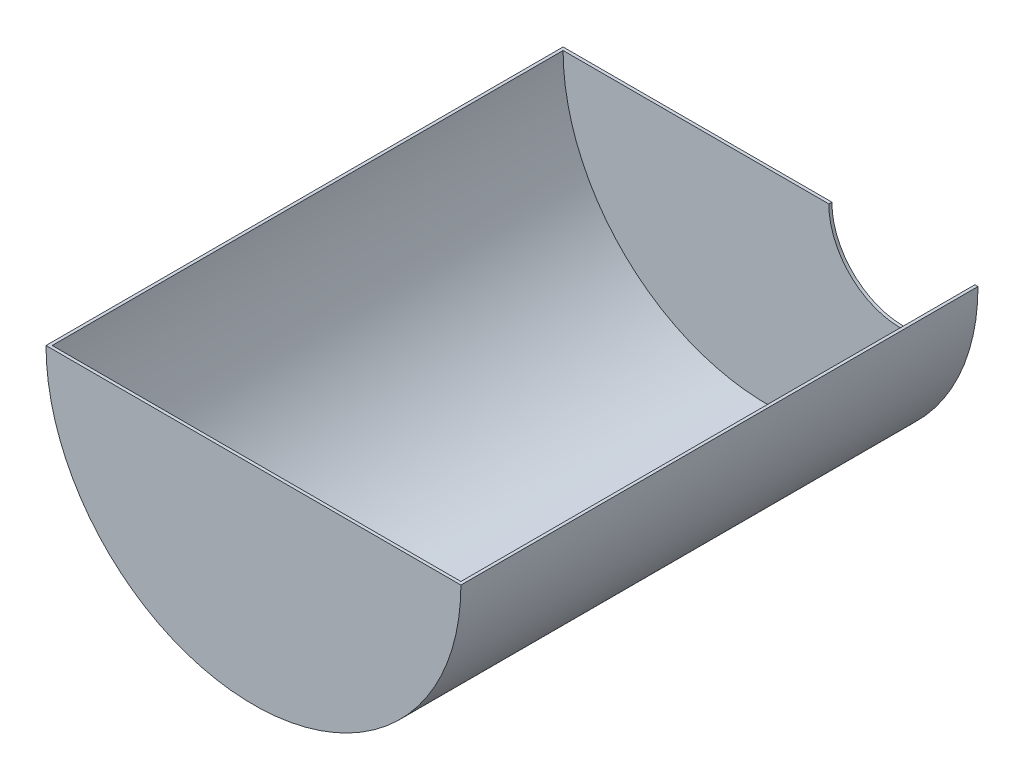
ISO-10303-21;
HEADER;
FILE_DESCRIPTION(('STEP AP214'),'2;1');
FILE_NAME('part.step','',(''),(''),'','','');
FILE_SCHEMA(('AUTOMOTIVE_DESIGN { 1 0 10303 214 1 1 1 1 }'));
ENDSEC;
DATA;
#1=APPLICATION_CONTEXT('core data for automotive mechanical design processes');
#2=APPLICATION_PROTOCOL_DEFINITION('international standard','automotive_design',2000,#1);
#3=PRODUCT_CONTEXT('',#1,'mechanical');
#4=PRODUCT('Part','Part','',(#3));
#5=PRODUCT_RELATED_PRODUCT_CATEGORY('part','',(#4));
#6=PRODUCT_DEFINITION_FORMATION('','',#4);
#7=PRODUCT_DEFINITION_CONTEXT('part definition',#1,'design');
#8=PRODUCT_DEFINITION('design','',#6,#7);
#9=PRODUCT_DEFINITION_SHAPE('','',#8);
#10=(LENGTH_UNIT() NAMED_UNIT(*) SI_UNIT(.MILLI.,.METRE.));
#11=(NAMED_UNIT(*) PLANE_ANGLE_UNIT() SI_UNIT($,.RADIAN.));
#12=(NAMED_UNIT(*) SI_UNIT($,.STERADIAN.) SOLID_ANGLE_UNIT());
#13=UNCERTAINTY_MEASURE_WITH_UNIT(LENGTH_MEASURE(1.E-05),#10,'distance_accuracy_value','');
#14=(GEOMETRIC_REPRESENTATION_CONTEXT(3) GLOBAL_UNCERTAINTY_ASSIGNED_CONTEXT((#13)) GLOBAL_UNIT_ASSIGNED_CONTEXT((#10,
#11,#12)) REPRESENTATION_CONTEXT('',''));
#15=CARTESIAN_POINT('',(0.,0.,0.));
#16=DIRECTION('',(0.,0.,1.));
#17=DIRECTION('',(1.,0.,0.));
#18=AXIS2_PLACEMENT_3D('',#15,#16,#17);
#19=CARTESIAN_POINT('',(-200.,-1.39659253553725E-12,500.));
#20=DIRECTION('',(0.,-1.,0.));
#21=DIRECTION('',(1.,0.,0.));
#22=AXIS2_PLACEMENT_3D('',#19,#20,#21);
#23=PLANE('',#22);
#24=DIRECTION('',(-1.,0.,0.));
#25=VECTOR('',#24,1.);
#26=CARTESIAN_POINT('',(-200.,-1.39659253553725E-12,0.));
#27=LINE('',#26,#25);
#28=CARTESIAN_POINT('',(60.,-4.88807387438039E-13,0.));
#29=VERTEX_POINT('',#28);
#30=CARTESIAN_POINT('',(-200.,-1.39659253553725E-12,0.));
#31=VERTEX_POINT('',#30);
#32=EDGE_CURVE('E107',#29,#31,#27,.T.);
#33=ORIENTED_EDGE('',*,*,#32,.F.);
#34=DIRECTION('',(0.,0.,-1.));
#35=VECTOR('',#34,1.);
#36=CARTESIAN_POINT('',(60.,0.,7.));
#37=LINE('',#36,#35);
#38=CARTESIAN_POINT('',(60.,0.,-3.));
#39=VERTEX_POINT('',#38);
#40=EDGE_CURVE('E58',#29,#39,#37,.T.);
#41=ORIENTED_EDGE('',*,*,#40,.T.);
#42=DIRECTION('',(-1.,0.,0.));
#43=VECTOR('',#42,1.);
#44=CARTESIAN_POINT('',(-200.,-1.39659253553725E-12,-3.));
#45=LINE('',#44,#43);
#46=CARTESIAN_POINT('',(-203.,-1.40706697955378E-12,-3.));
#47=VERTEX_POINT('',#46);
#48=EDGE_CURVE('E104',#39,#47,#45,.T.);
#49=ORIENTED_EDGE('',*,*,#48,.T.);
#50=DIRECTION('',(0.,0.,-1.));
#51=VECTOR('',#50,1.);
#52=CARTESIAN_POINT('',(-203.,-1.40706697955378E-12,503.));
#53=LINE('',#52,#51);
#54=CARTESIAN_POINT('',(-203.,-1.40706697955378E-12,503.));
#55=VERTEX_POINT('',#54);
#56=EDGE_CURVE('E124',#55,#47,#53,.T.);
#57=ORIENTED_EDGE('',*,*,#56,.F.);
#58=DIRECTION('',(-1.,0.,0.));
#59=VECTOR('',#58,1.);
#60=CARTESIAN_POINT('',(-200.,-1.39659253553725E-12,503.));
#61=LINE('',#60,#59);
#62=CARTESIAN_POINT('',(203.,0.,503.));
#63=VERTEX_POINT('',#62);
#64=EDGE_CURVE('E126',#63,#55,#61,.T.);
#65=ORIENTED_EDGE('',*,*,#64,.F.);
#66=DIRECTION('',(0.,0.,-1.));
#67=VECTOR('',#66,1.);
#68=CARTESIAN_POINT('',(203.,0.,503.));
#69=LINE('',#68,#67);
#70=CARTESIAN_POINT('',(203.,0.,-3.));
#71=VERTEX_POINT('',#70);
#72=EDGE_CURVE('E52',#63,#71,#69,.T.);
#73=ORIENTED_EDGE('',*,*,#72,.T.);
#74=CARTESIAN_POINT('',(200.,0.,-3.));
#75=VERTEX_POINT('',#74);
#76=EDGE_CURVE('E114',#71,#75,#45,.T.);
#77=ORIENTED_EDGE('',*,*,#76,.T.);
#78=DIRECTION('',(0.,0.,-1.));
#79=VECTOR('',#78,1.);
#80=CARTESIAN_POINT('',(200.,0.,7.));
#81=LINE('',#80,#79);
#82=CARTESIAN_POINT('',(200.,0.,0.));
#83=VERTEX_POINT('',#82);
#84=EDGE_CURVE('E95',#83,#75,#81,.T.);
#85=ORIENTED_EDGE('',*,*,#84,.F.);
#86=DIRECTION('',(0.,0.,-1.));
#87=VECTOR('',#86,1.);
#88=CARTESIAN_POINT('',(200.,0.,500.));
#89=LINE('',#88,#87);
#90=CARTESIAN_POINT('',(200.,0.,500.));
#91=VERTEX_POINT('',#90);
#92=EDGE_CURVE('E119',#91,#83,#89,.T.);
#93=ORIENTED_EDGE('',*,*,#92,.F.);
#94=DIRECTION('',(-1.,0.,0.));
#95=VECTOR('',#94,1.);
#96=CARTESIAN_POINT('',(-200.,-1.39659253553725E-12,500.));
#97=LINE('',#96,#95);
#98=CARTESIAN_POINT('',(-200.,-1.39659253553725E-12,500.));
#99=VERTEX_POINT('',#98);
#100=EDGE_CURVE('E139',#91,#99,#97,.T.);
#101=ORIENTED_EDGE('',*,*,#100,.T.);
#102=DIRECTION('',(0.,0.,-1.));
#103=VECTOR('',#102,1.);
#104=CARTESIAN_POINT('',(-200.,-1.39659253553725E-12,500.));
#105=LINE('',#104,#103);
#106=EDGE_CURVE('E136',#99,#31,#105,.T.);
#107=ORIENTED_EDGE('',*,*,#106,.T.);
#108=EDGE_LOOP('',(#33,#41,#49,#57,#65,#73,#77,#85,#93,#101,#107));
#109=FACE_BOUND('',#108,.T.);
#110=ADVANCED_FACE('F43',(#109),#23,.F.);
#111=CARTESIAN_POINT('',(0.,0.,500.));
#112=DIRECTION('',(0.,0.,-1.));
#113=DIRECTION('',(-1.,0.,0.));
#114=AXIS2_PLACEMENT_3D('',#111,#112,#113);
#115=CYLINDRICAL_SURFACE('',#114,203.);
#116=CARTESIAN_POINT('',(0.,0.,-3.));
#117=DIRECTION('',(0.,0.,1.));
#118=DIRECTION('',(1.,0.,0.));
#119=AXIS2_PLACEMENT_3D('',#116,#117,#118);
#120=CIRCLE('',#119,203.);
#121=EDGE_CURVE('E112',#47,#71,#120,.T.);
#122=ORIENTED_EDGE('',*,*,#121,.T.);
#123=ORIENTED_EDGE('',*,*,#72,.F.);
#124=CARTESIAN_POINT('',(0.,0.,503.));
#125=DIRECTION('',(0.,0.,1.));
#126=DIRECTION('',(1.,0.,0.));
#127=AXIS2_PLACEMENT_3D('',#124,#125,#126);
#128=CIRCLE('',#127,203.);
#129=EDGE_CURVE('E118',#55,#63,#128,.T.);
#130=ORIENTED_EDGE('',*,*,#129,.F.);
#131=ORIENTED_EDGE('',*,*,#56,.T.);
#132=EDGE_LOOP('',(#122,#123,#130,#131));
#133=FACE_BOUND('',#132,.T.);
#134=ADVANCED_FACE('F168',(#133),#115,.T.);
#135=CARTESIAN_POINT('',(0.,0.,503.));
#136=DIRECTION('',(0.,0.,1.));
#137=DIRECTION('',(1.,0.,0.));
#138=AXIS2_PLACEMENT_3D('',#135,#136,#137);
#139=PLANE('',#138);
#140=ORIENTED_EDGE('',*,*,#129,.T.);
#141=ORIENTED_EDGE('',*,*,#64,.T.);
#142=EDGE_LOOP('',(#140,#141));
#143=FACE_BOUND('',#142,.T.);
#144=ADVANCED_FACE('F173',(#143),#139,.T.);
#145=CARTESIAN_POINT('',(0.,0.,-3.));
#146=DIRECTION('',(0.,0.,1.));
#147=DIRECTION('',(1.,0.,0.));
#148=AXIS2_PLACEMENT_3D('',#145,#146,#147);
#149=PLANE('',#148);
#150=ORIENTED_EDGE('',*,*,#48,.F.);
#151=CARTESIAN_POINT('',(130.,0.,-3.));
#152=DIRECTION('',(0.,0.,-1.));
#153=DIRECTION('',(-1.,0.,0.));
#154=AXIS2_PLACEMENT_3D('',#151,#152,#153);
#155=CIRCLE('',#154,70.);
#156=EDGE_CURVE('E92',#75,#39,#155,.T.);
#157=ORIENTED_EDGE('',*,*,#156,.F.);
#158=ORIENTED_EDGE('',*,*,#76,.F.);
#159=ORIENTED_EDGE('',*,*,#121,.F.);
#160=EDGE_LOOP('',(#150,#157,#158,#159));
#161=FACE_BOUND('',#160,.T.);
#162=ADVANCED_FACE('F45',(#161),#149,.F.);
#163=CARTESIAN_POINT('',(0.,0.,500.));
#164=DIRECTION('',(0.,0.,-1.));
#165=DIRECTION('',(-1.,0.,0.));
#166=AXIS2_PLACEMENT_3D('',#163,#164,#165);
#167=CYLINDRICAL_SURFACE('',#166,200.);
#168=CARTESIAN_POINT('',(0.,0.,0.));
#169=DIRECTION('',(0.,0.,1.));
#170=DIRECTION('',(1.,0.,0.));
#171=AXIS2_PLACEMENT_3D('',#168,#169,#170);
#172=CIRCLE('',#171,200.);
#173=EDGE_CURVE('E142',#31,#83,#172,.T.);
#174=ORIENTED_EDGE('',*,*,#173,.F.);
#175=ORIENTED_EDGE('',*,*,#106,.F.);
#176=CARTESIAN_POINT('',(0.,0.,500.));
#177=DIRECTION('',(0.,0.,1.));
#178=DIRECTION('',(1.,0.,0.));
#179=AXIS2_PLACEMENT_3D('',#176,#177,#178);
#180=CIRCLE('',#179,200.);
#181=EDGE_CURVE('E66',#99,#91,#180,.T.);
#182=ORIENTED_EDGE('',*,*,#181,.T.);
#183=ORIENTED_EDGE('',*,*,#92,.T.);
#184=EDGE_LOOP('',(#174,#175,#182,#183));
#185=FACE_BOUND('',#184,.T.);
#186=ADVANCED_FACE('F157',(#185),#167,.F.);
#187=CARTESIAN_POINT('',(0.,0.,500.));
#188=DIRECTION('',(0.,0.,1.));
#189=DIRECTION('',(1.,0.,0.));
#190=AXIS2_PLACEMENT_3D('',#187,#188,#189);
#191=PLANE('',#190);
#192=ORIENTED_EDGE('',*,*,#181,.F.);
#193=ORIENTED_EDGE('',*,*,#100,.F.);
#194=EDGE_LOOP('',(#192,#193));
#195=FACE_BOUND('',#194,.T.);
#196=ADVANCED_FACE('F154',(#195),#191,.F.);
#197=CARTESIAN_POINT('',(0.,0.,0.));
#198=DIRECTION('',(0.,0.,1.));
#199=DIRECTION('',(1.,0.,0.));
#200=AXIS2_PLACEMENT_3D('',#197,#198,#199);
#201=PLANE('',#200);
#202=CARTESIAN_POINT('',(130.,0.,0.));
#203=DIRECTION('',(0.,0.,1.));
#204=DIRECTION('',(1.,0.,0.));
#205=AXIS2_PLACEMENT_3D('',#202,#203,#204);
#206=CIRCLE('',#205,70.);
#207=EDGE_CURVE('E11',#29,#83,#206,.T.);
#208=ORIENTED_EDGE('',*,*,#207,.F.);
#209=ORIENTED_EDGE('',*,*,#32,.T.);
#210=ORIENTED_EDGE('',*,*,#173,.T.);
#211=EDGE_LOOP('',(#208,#209,#210));
#212=FACE_BOUND('',#211,.T.);
#213=ADVANCED_FACE('F156',(#212),#201,.T.);
#214=CARTESIAN_POINT('',(130.,0.,7.));
#215=DIRECTION('',(0.,0.,-1.));
#216=DIRECTION('',(-1.,0.,0.));
#217=AXIS2_PLACEMENT_3D('',#214,#215,#216);
#218=CYLINDRICAL_SURFACE('',#217,70.);
#219=ORIENTED_EDGE('',*,*,#207,.T.);
#220=ORIENTED_EDGE('',*,*,#84,.T.);
#221=ORIENTED_EDGE('',*,*,#156,.T.);
#222=ORIENTED_EDGE('',*,*,#40,.F.);
#223=EDGE_LOOP('',(#219,#220,#221,#222));
#224=FACE_BOUND('',#223,.T.);
#225=ADVANCED_FACE('F93',(#224),#218,.F.);
#226=CLOSED_SHELL('',(#110,#134,#144,#162,#186,#196,#213,#225));
#227=MANIFOLD_SOLID_BREP('B2',#226);
#228=ADVANCED_BREP_SHAPE_REPRESENTATION('',(#18,#227),#14);
#229=SHAPE_DEFINITION_REPRESENTATION(#9,#228);
ENDSEC;
END-ISO-10303-21;
